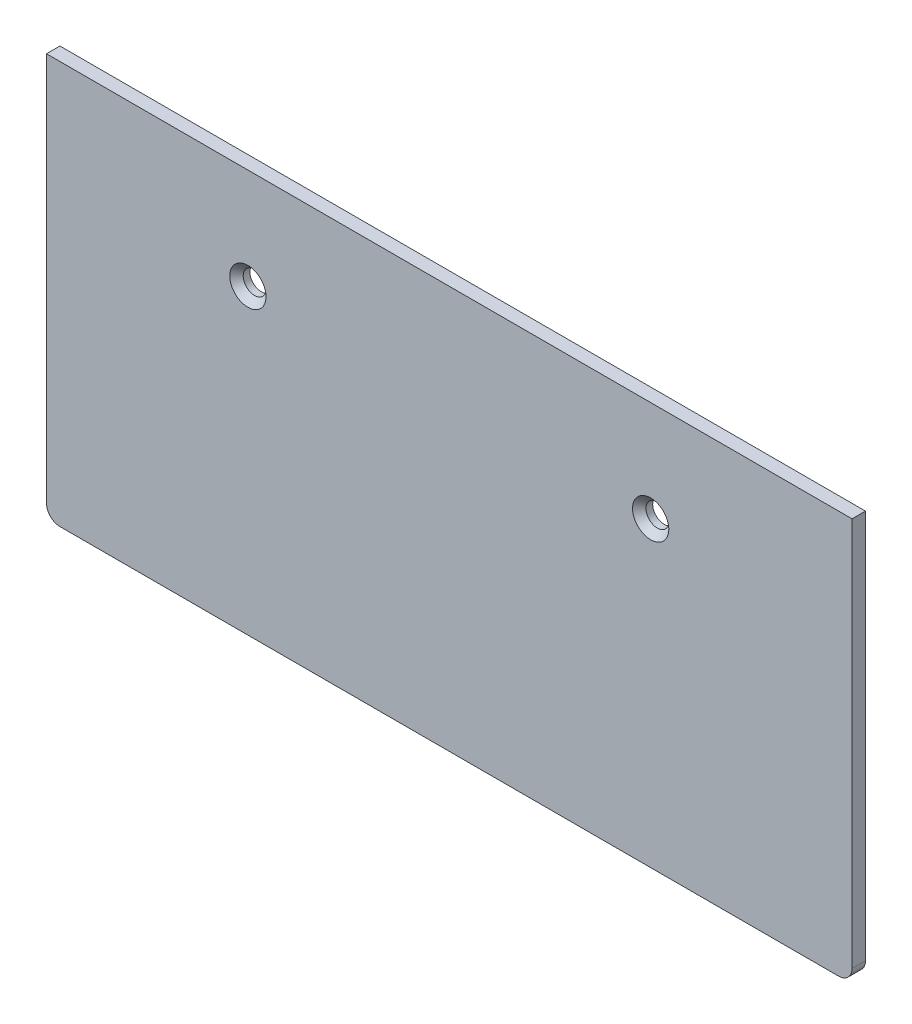
ISO-10303-21;
HEADER;
FILE_DESCRIPTION(('STEP AP214'),'2;1');
FILE_NAME('part.step','',(''),(''),'','','');
FILE_SCHEMA(('AUTOMOTIVE_DESIGN { 1 0 10303 214 1 1 1 1 }'));
ENDSEC;
DATA;
#1=APPLICATION_CONTEXT('core data for automotive mechanical design processes');
#2=APPLICATION_PROTOCOL_DEFINITION('international standard','automotive_design',2000,#1);
#3=PRODUCT_CONTEXT('',#1,'mechanical');
#4=PRODUCT('Part','Part','',(#3));
#5=PRODUCT_RELATED_PRODUCT_CATEGORY('part','',(#4));
#6=PRODUCT_DEFINITION_FORMATION('','',#4);
#7=PRODUCT_DEFINITION_CONTEXT('part definition',#1,'design');
#8=PRODUCT_DEFINITION('design','',#6,#7);
#9=PRODUCT_DEFINITION_SHAPE('','',#8);
#10=(LENGTH_UNIT() NAMED_UNIT(*) SI_UNIT(.MILLI.,.METRE.));
#11=(NAMED_UNIT(*) PLANE_ANGLE_UNIT() SI_UNIT($,.RADIAN.));
#12=(NAMED_UNIT(*) SI_UNIT($,.STERADIAN.) SOLID_ANGLE_UNIT());
#13=UNCERTAINTY_MEASURE_WITH_UNIT(LENGTH_MEASURE(1.E-05),#10,'distance_accuracy_value','');
#14=(GEOMETRIC_REPRESENTATION_CONTEXT(3) GLOBAL_UNCERTAINTY_ASSIGNED_CONTEXT((#13)) GLOBAL_UNIT_ASSIGNED_CONTEXT((#10,
#11,#12)) REPRESENTATION_CONTEXT('',''));
#15=CARTESIAN_POINT('',(0.,0.,0.));
#16=DIRECTION('',(0.,0.,1.));
#17=DIRECTION('',(1.,0.,0.));
#18=AXIS2_PLACEMENT_3D('',#15,#16,#17);
#19=CARTESIAN_POINT('',(118.,2.,-2.));
#20=DIRECTION('',(0.,0.,1.));
#21=DIRECTION('',(1.,0.,0.));
#22=AXIS2_PLACEMENT_3D('',#19,#20,#21);
#23=CYLINDRICAL_SURFACE('',#22,2.);
#24=DIRECTION('',(0.,0.,1.));
#25=VECTOR('',#24,1.);
#26=CARTESIAN_POINT('',(118.,0.,-2.));
#27=LINE('',#26,#25);
#28=CARTESIAN_POINT('',(118.,0.,-2.));
#29=VERTEX_POINT('',#28);
#30=CARTESIAN_POINT('',(118.,0.,0.));
#31=VERTEX_POINT('',#30);
#32=EDGE_CURVE('E131',#29,#31,#27,.T.);
#33=ORIENTED_EDGE('',*,*,#32,.F.);
#34=CARTESIAN_POINT('',(118.,2.,-2.));
#35=DIRECTION('',(0.,0.,-1.));
#36=DIRECTION('',(-1.,0.,0.));
#37=AXIS2_PLACEMENT_3D('',#34,#35,#36);
#38=CIRCLE('',#37,2.);
#39=CARTESIAN_POINT('',(120.,2.,-2.));
#40=VERTEX_POINT('',#39);
#41=EDGE_CURVE('E47',#40,#29,#38,.T.);
#42=ORIENTED_EDGE('',*,*,#41,.F.);
#43=DIRECTION('',(0.,0.,1.));
#44=VECTOR('',#43,1.);
#45=CARTESIAN_POINT('',(120.,2.,-2.));
#46=LINE('',#45,#44);
#47=CARTESIAN_POINT('',(120.,2.,0.));
#48=VERTEX_POINT('',#47);
#49=EDGE_CURVE('E91',#48,#40,#46,.F.);
#50=ORIENTED_EDGE('',*,*,#49,.F.);
#51=CARTESIAN_POINT('',(118.,2.,0.));
#52=DIRECTION('',(0.,0.,-1.));
#53=DIRECTION('',(-1.,0.,0.));
#54=AXIS2_PLACEMENT_3D('',#51,#52,#53);
#55=CIRCLE('',#54,2.);
#56=EDGE_CURVE('E55',#31,#48,#55,.F.);
#57=ORIENTED_EDGE('',*,*,#56,.F.);
#58=EDGE_LOOP('',(#33,#42,#50,#57));
#59=FACE_BOUND('',#58,.T.);
#60=ADVANCED_FACE('F32',(#59),#23,.T.);
#61=CARTESIAN_POINT('',(2.,2.,-2.));
#62=DIRECTION('',(0.,0.,1.));
#63=DIRECTION('',(1.,0.,0.));
#64=AXIS2_PLACEMENT_3D('',#61,#62,#63);
#65=CYLINDRICAL_SURFACE('',#64,2.);
#66=DIRECTION('',(0.,0.,1.));
#67=VECTOR('',#66,1.);
#68=CARTESIAN_POINT('',(0.,2.,-2.));
#69=LINE('',#68,#67);
#70=CARTESIAN_POINT('',(0.,2.,-2.));
#71=VERTEX_POINT('',#70);
#72=CARTESIAN_POINT('',(0.,2.,0.));
#73=VERTEX_POINT('',#72);
#74=EDGE_CURVE('E120',#71,#73,#69,.T.);
#75=ORIENTED_EDGE('',*,*,#74,.F.);
#76=CARTESIAN_POINT('',(2.,2.,-2.));
#77=DIRECTION('',(0.,0.,-1.));
#78=DIRECTION('',(-1.,0.,0.));
#79=AXIS2_PLACEMENT_3D('',#76,#77,#78);
#80=CIRCLE('',#79,2.);
#81=CARTESIAN_POINT('',(2.,0.,-2.));
#82=VERTEX_POINT('',#81);
#83=EDGE_CURVE('E127',#82,#71,#80,.T.);
#84=ORIENTED_EDGE('',*,*,#83,.F.);
#85=DIRECTION('',(0.,0.,1.));
#86=VECTOR('',#85,1.);
#87=CARTESIAN_POINT('',(2.,0.,-2.));
#88=LINE('',#87,#86);
#89=CARTESIAN_POINT('',(2.,0.,0.));
#90=VERTEX_POINT('',#89);
#91=EDGE_CURVE('E124',#90,#82,#88,.F.);
#92=ORIENTED_EDGE('',*,*,#91,.F.);
#93=CARTESIAN_POINT('',(2.,2.,0.));
#94=DIRECTION('',(0.,0.,-1.));
#95=DIRECTION('',(-1.,0.,0.));
#96=AXIS2_PLACEMENT_3D('',#93,#94,#95);
#97=CIRCLE('',#96,2.);
#98=EDGE_CURVE('E129',#73,#90,#97,.F.);
#99=ORIENTED_EDGE('',*,*,#98,.F.);
#100=EDGE_LOOP('',(#75,#84,#92,#99));
#101=FACE_BOUND('',#100,.T.);
#102=ADVANCED_FACE('F158',(#101),#65,.T.);
#103=CARTESIAN_POINT('',(0.,0.,-2.));
#104=DIRECTION('',(-1.,0.,0.));
#105=DIRECTION('',(0.,0.,1.));
#106=AXIS2_PLACEMENT_3D('',#103,#104,#105);
#107=PLANE('',#106);
#108=DIRECTION('',(0.,-1.,0.));
#109=VECTOR('',#108,1.);
#110=CARTESIAN_POINT('',(0.,0.,-2.));
#111=LINE('',#110,#109);
#112=CARTESIAN_POINT('',(0.,60.,-2.));
#113=VERTEX_POINT('',#112);
#114=EDGE_CURVE('E107',#113,#71,#111,.T.);
#115=ORIENTED_EDGE('',*,*,#114,.T.);
#116=ORIENTED_EDGE('',*,*,#74,.T.);
#117=DIRECTION('',(0.,-1.,0.));
#118=VECTOR('',#117,1.);
#119=CARTESIAN_POINT('',(0.,0.,0.));
#120=LINE('',#119,#118);
#121=CARTESIAN_POINT('',(0.,60.,0.));
#122=VERTEX_POINT('',#121);
#123=EDGE_CURVE('E111',#122,#73,#120,.T.);
#124=ORIENTED_EDGE('',*,*,#123,.F.);
#125=DIRECTION('',(0.,0.,1.));
#126=VECTOR('',#125,1.);
#127=CARTESIAN_POINT('',(0.,60.,-2.));
#128=LINE('',#127,#126);
#129=EDGE_CURVE('E102',#113,#122,#128,.T.);
#130=ORIENTED_EDGE('',*,*,#129,.F.);
#131=EDGE_LOOP('',(#115,#116,#124,#130));
#132=FACE_BOUND('',#131,.T.);
#133=ADVANCED_FACE('F163',(#132),#107,.T.);
#134=CARTESIAN_POINT('',(0.,60.,-2.));
#135=DIRECTION('',(0.,1.,0.));
#136=DIRECTION('',(0.,0.,1.));
#137=AXIS2_PLACEMENT_3D('',#134,#135,#136);
#138=PLANE('',#137);
#139=DIRECTION('',(-1.,0.,0.));
#140=VECTOR('',#139,1.);
#141=CARTESIAN_POINT('',(0.,60.,0.));
#142=LINE('',#141,#140);
#143=CARTESIAN_POINT('',(120.,60.,0.));
#144=VERTEX_POINT('',#143);
#145=EDGE_CURVE('E101',#144,#122,#142,.T.);
#146=ORIENTED_EDGE('',*,*,#145,.F.);
#147=DIRECTION('',(0.,0.,1.));
#148=VECTOR('',#147,1.);
#149=CARTESIAN_POINT('',(120.,60.,-2.));
#150=LINE('',#149,#148);
#151=CARTESIAN_POINT('',(120.,60.,-2.));
#152=VERTEX_POINT('',#151);
#153=EDGE_CURVE('E89',#152,#144,#150,.T.);
#154=ORIENTED_EDGE('',*,*,#153,.F.);
#155=DIRECTION('',(-1.,0.,0.));
#156=VECTOR('',#155,1.);
#157=CARTESIAN_POINT('',(0.,60.,-2.));
#158=LINE('',#157,#156);
#159=EDGE_CURVE('E94',#152,#113,#158,.T.);
#160=ORIENTED_EDGE('',*,*,#159,.T.);
#161=ORIENTED_EDGE('',*,*,#129,.T.);
#162=EDGE_LOOP('',(#146,#154,#160,#161));
#163=FACE_BOUND('',#162,.T.);
#164=ADVANCED_FACE('F99',(#163),#138,.T.);
#165=CARTESIAN_POINT('',(120.,0.,-2.));
#166=DIRECTION('',(1.,0.,0.));
#167=DIRECTION('',(0.,0.,-1.));
#168=AXIS2_PLACEMENT_3D('',#165,#166,#167);
#169=PLANE('',#168);
#170=DIRECTION('',(0.,1.,0.));
#171=VECTOR('',#170,1.);
#172=CARTESIAN_POINT('',(120.,0.,0.));
#173=LINE('',#172,#171);
#174=EDGE_CURVE('E117',#48,#144,#173,.T.);
#175=ORIENTED_EDGE('',*,*,#174,.F.);
#176=ORIENTED_EDGE('',*,*,#49,.T.);
#177=DIRECTION('',(0.,1.,0.));
#178=VECTOR('',#177,1.);
#179=CARTESIAN_POINT('',(120.,0.,-2.));
#180=LINE('',#179,#178);
#181=EDGE_CURVE('E85',#40,#152,#180,.T.);
#182=ORIENTED_EDGE('',*,*,#181,.T.);
#183=ORIENTED_EDGE('',*,*,#153,.T.);
#184=EDGE_LOOP('',(#175,#176,#182,#183));
#185=FACE_BOUND('',#184,.T.);
#186=ADVANCED_FACE('F88',(#185),#169,.T.);
#187=CARTESIAN_POINT('',(0.,0.,-2.));
#188=DIRECTION('',(0.,-1.,0.));
#189=DIRECTION('',(0.,0.,-1.));
#190=AXIS2_PLACEMENT_3D('',#187,#188,#189);
#191=PLANE('',#190);
#192=DIRECTION('',(1.,0.,0.));
#193=VECTOR('',#192,1.);
#194=CARTESIAN_POINT('',(0.,0.,-2.));
#195=LINE('',#194,#193);
#196=EDGE_CURVE('E95',#82,#29,#195,.T.);
#197=ORIENTED_EDGE('',*,*,#196,.T.);
#198=ORIENTED_EDGE('',*,*,#32,.T.);
#199=DIRECTION('',(1.,0.,0.));
#200=VECTOR('',#199,1.);
#201=CARTESIAN_POINT('',(0.,0.,0.));
#202=LINE('',#201,#200);
#203=EDGE_CURVE('E114',#90,#31,#202,.T.);
#204=ORIENTED_EDGE('',*,*,#203,.F.);
#205=ORIENTED_EDGE('',*,*,#91,.T.);
#206=EDGE_LOOP('',(#197,#198,#204,#205));
#207=FACE_BOUND('',#206,.T.);
#208=ADVANCED_FACE('F170',(#207),#191,.T.);
#209=CARTESIAN_POINT('',(0.,0.,-2.));
#210=DIRECTION('',(0.,0.,-1.));
#211=DIRECTION('',(-1.,0.,0.));
#212=AXIS2_PLACEMENT_3D('',#209,#210,#211);
#213=PLANE('',#212);
#214=CARTESIAN_POINT('',(30.,45.,-2.));
#215=DIRECTION('',(0.,0.,1.));
#216=DIRECTION('',(-1.,0.,0.));
#217=AXIS2_PLACEMENT_3D('',#214,#215,#216);
#218=CIRCLE('',#217,1.7);
#219=CARTESIAN_POINT('',(28.3,45.,-2.));
#220=VERTEX_POINT('',#219);
#221=EDGE_CURVE('E195',#220,#220,#218,.T.);
#222=ORIENTED_EDGE('',*,*,#221,.T.);
#223=EDGE_LOOP('',(#222));
#224=FACE_BOUND('',#223,.T.);
#225=CARTESIAN_POINT('',(90.,45.,-2.));
#226=DIRECTION('',(0.,0.,1.));
#227=DIRECTION('',(1.,0.,0.));
#228=AXIS2_PLACEMENT_3D('',#225,#226,#227);
#229=CIRCLE('',#228,1.7);
#230=CARTESIAN_POINT('',(91.7,45.,-2.));
#231=VERTEX_POINT('',#230);
#232=EDGE_CURVE('E115',#231,#231,#229,.T.);
#233=ORIENTED_EDGE('',*,*,#232,.T.);
#234=EDGE_LOOP('',(#233));
#235=FACE_BOUND('',#234,.T.);
#236=ORIENTED_EDGE('',*,*,#181,.F.);
#237=ORIENTED_EDGE('',*,*,#41,.T.);
#238=ORIENTED_EDGE('',*,*,#196,.F.);
#239=ORIENTED_EDGE('',*,*,#83,.T.);
#240=ORIENTED_EDGE('',*,*,#114,.F.);
#241=ORIENTED_EDGE('',*,*,#159,.F.);
#242=EDGE_LOOP('',(#236,#237,#238,#239,#240,#241));
#243=FACE_BOUND('',#242,.T.);
#244=ADVANCED_FACE('F105',(#224,#235,#243),#213,.T.);
#245=CARTESIAN_POINT('',(0.,0.,0.));
#246=DIRECTION('',(0.,0.,-1.));
#247=DIRECTION('',(-1.,0.,0.));
#248=AXIS2_PLACEMENT_3D('',#245,#246,#247);
#249=PLANE('',#248);
#250=CARTESIAN_POINT('',(90.,45.,0.));
#251=DIRECTION('',(0.,0.,-1.));
#252=DIRECTION('',(-1.,0.,0.));
#253=AXIS2_PLACEMENT_3D('',#250,#251,#252);
#254=CIRCLE('',#253,2.69999999999997);
#255=CARTESIAN_POINT('',(87.3,45.,0.));
#256=VERTEX_POINT('',#255);
#257=EDGE_CURVE('E11',#256,#256,#254,.T.);
#258=ORIENTED_EDGE('',*,*,#257,.T.);
#259=EDGE_LOOP('',(#258));
#260=FACE_BOUND('',#259,.T.);
#261=CARTESIAN_POINT('',(30.,45.,0.));
#262=DIRECTION('',(0.,0.,-1.));
#263=DIRECTION('',(-1.,0.,0.));
#264=AXIS2_PLACEMENT_3D('',#261,#262,#263);
#265=CIRCLE('',#264,2.69999999999997);
#266=CARTESIAN_POINT('',(27.3,45.,0.));
#267=VERTEX_POINT('',#266);
#268=EDGE_CURVE('E140',#267,#267,#265,.T.);
#269=ORIENTED_EDGE('',*,*,#268,.T.);
#270=EDGE_LOOP('',(#269));
#271=FACE_BOUND('',#270,.T.);
#272=ORIENTED_EDGE('',*,*,#203,.T.);
#273=ORIENTED_EDGE('',*,*,#56,.T.);
#274=ORIENTED_EDGE('',*,*,#174,.T.);
#275=ORIENTED_EDGE('',*,*,#145,.T.);
#276=ORIENTED_EDGE('',*,*,#123,.T.);
#277=ORIENTED_EDGE('',*,*,#98,.T.);
#278=EDGE_LOOP('',(#272,#273,#274,#275,#276,#277));
#279=FACE_BOUND('',#278,.T.);
#280=ADVANCED_FACE('F178',(#260,#271,#279),#249,.F.);
#281=CARTESIAN_POINT('',(90.,45.,-2.));
#282=DIRECTION('',(0.,0.,1.));
#283=DIRECTION('',(1.,0.,0.));
#284=AXIS2_PLACEMENT_3D('',#281,#282,#283);
#285=CYLINDRICAL_SURFACE('',#284,1.7);
#286=CARTESIAN_POINT('',(90.,45.,-0.999999999999973));
#287=DIRECTION('',(0.,0.,-1.));
#288=DIRECTION('',(-1.,0.,0.));
#289=AXIS2_PLACEMENT_3D('',#286,#287,#288);
#290=CIRCLE('',#289,1.7);
#291=CARTESIAN_POINT('',(88.3,45.,-0.999999999999973));
#292=VERTEX_POINT('',#291);
#293=EDGE_CURVE('E40',#292,#292,#290,.F.);
#294=ORIENTED_EDGE('',*,*,#293,.T.);
#295=EDGE_LOOP('',(#294));
#296=FACE_BOUND('',#295,.T.);
#297=ORIENTED_EDGE('',*,*,#232,.F.);
#298=EDGE_LOOP('',(#297));
#299=FACE_BOUND('',#298,.T.);
#300=ADVANCED_FACE('F145',(#296,#299),#285,.F.);
#301=CARTESIAN_POINT('',(30.,45.,-2.));
#302=DIRECTION('',(0.,0.,1.));
#303=DIRECTION('',(1.,0.,0.));
#304=AXIS2_PLACEMENT_3D('',#301,#302,#303);
#305=CYLINDRICAL_SURFACE('',#304,1.7);
#306=CARTESIAN_POINT('',(30.,45.,-0.999999999999973));
#307=DIRECTION('',(0.,0.,-1.));
#308=DIRECTION('',(-1.,0.,0.));
#309=AXIS2_PLACEMENT_3D('',#306,#307,#308);
#310=CIRCLE('',#309,1.7);
#311=CARTESIAN_POINT('',(28.3,45.,-0.999999999999973));
#312=VERTEX_POINT('',#311);
#313=EDGE_CURVE('E137',#312,#312,#310,.F.);
#314=ORIENTED_EDGE('',*,*,#313,.T.);
#315=EDGE_LOOP('',(#314));
#316=FACE_BOUND('',#315,.T.);
#317=ORIENTED_EDGE('',*,*,#221,.F.);
#318=EDGE_LOOP('',(#317));
#319=FACE_BOUND('',#318,.T.);
#320=ADVANCED_FACE('F154',(#316,#319),#305,.F.);
#321=CARTESIAN_POINT('',(30.,45.,-0.999999999999973));
#322=DIRECTION('',(0.,0.,1.));
#323=DIRECTION('',(1.,0.,0.));
#324=AXIS2_PLACEMENT_3D('',#321,#322,#323);
#325=CONICAL_SURFACE('',#324,1.7,0.785398163397445);
#326=ORIENTED_EDGE('',*,*,#268,.F.);
#327=EDGE_LOOP('',(#326));
#328=FACE_BOUND('',#327,.T.);
#329=ORIENTED_EDGE('',*,*,#313,.F.);
#330=EDGE_LOOP('',(#329));
#331=FACE_BOUND('',#330,.T.);
#332=ADVANCED_FACE('F149',(#328,#331),#325,.F.);
#333=CARTESIAN_POINT('',(90.,45.,-0.999999999999973));
#334=DIRECTION('',(0.,0.,1.));
#335=DIRECTION('',(1.,0.,0.));
#336=AXIS2_PLACEMENT_3D('',#333,#334,#335);
#337=CONICAL_SURFACE('',#336,1.7,0.785398163397445);
#338=ORIENTED_EDGE('',*,*,#257,.F.);
#339=EDGE_LOOP('',(#338));
#340=FACE_BOUND('',#339,.T.);
#341=ORIENTED_EDGE('',*,*,#293,.F.);
#342=EDGE_LOOP('',(#341));
#343=FACE_BOUND('',#342,.T.);
#344=ADVANCED_FACE('F34',(#340,#343),#337,.F.);
#345=CLOSED_SHELL('',(#60,#102,#133,#164,#186,#208,#244,#280,#300,#320,#332,#344));
#346=MANIFOLD_SOLID_BREP('B2',#345);
#347=ADVANCED_BREP_SHAPE_REPRESENTATION('',(#18,#346),#14);
#348=SHAPE_DEFINITION_REPRESENTATION(#9,#347);
ENDSEC;
END-ISO-10303-21;
